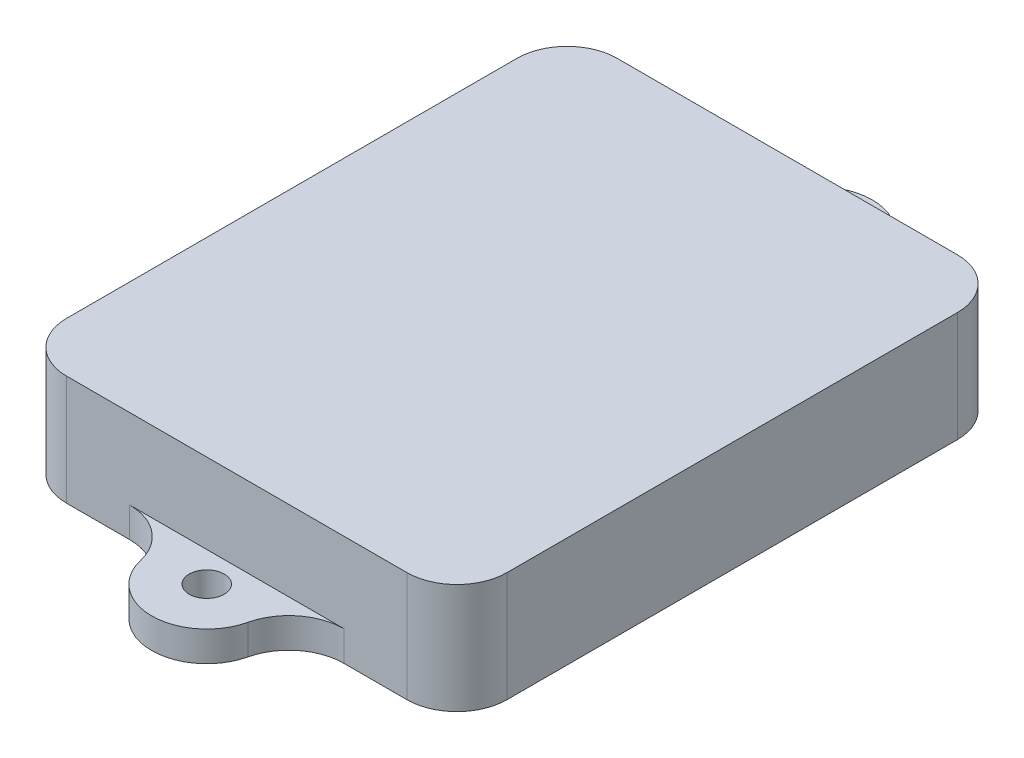
ISO-10303-21;
HEADER;
FILE_DESCRIPTION(('STEP AP214'),'2;1');
FILE_NAME('part.step','',(''),(''),'','','');
FILE_SCHEMA(('AUTOMOTIVE_DESIGN { 1 0 10303 214 1 1 1 1 }'));
ENDSEC;
DATA;
#1=APPLICATION_CONTEXT('core data for automotive mechanical design processes');
#2=APPLICATION_PROTOCOL_DEFINITION('international standard','automotive_design',2000,#1);
#3=PRODUCT_CONTEXT('',#1,'mechanical');
#4=PRODUCT('Part','Part','',(#3));
#5=PRODUCT_RELATED_PRODUCT_CATEGORY('part','',(#4));
#6=PRODUCT_DEFINITION_FORMATION('','',#4);
#7=PRODUCT_DEFINITION_CONTEXT('part definition',#1,'design');
#8=PRODUCT_DEFINITION('design','',#6,#7);
#9=PRODUCT_DEFINITION_SHAPE('','',#8);
#10=(LENGTH_UNIT() NAMED_UNIT(*) SI_UNIT(.MILLI.,.METRE.));
#11=(NAMED_UNIT(*) PLANE_ANGLE_UNIT() SI_UNIT($,.RADIAN.));
#12=(NAMED_UNIT(*) SI_UNIT($,.STERADIAN.) SOLID_ANGLE_UNIT());
#13=UNCERTAINTY_MEASURE_WITH_UNIT(LENGTH_MEASURE(1.E-05),#10,'distance_accuracy_value','');
#14=(GEOMETRIC_REPRESENTATION_CONTEXT(3) GLOBAL_UNCERTAINTY_ASSIGNED_CONTEXT((#13)) GLOBAL_UNIT_ASSIGNED_CONTEXT((#10,
#11,#12)) REPRESENTATION_CONTEXT('',''));
#15=CARTESIAN_POINT('',(0.,0.,0.));
#16=DIRECTION('',(0.,0.,1.));
#17=DIRECTION('',(1.,0.,0.));
#18=AXIS2_PLACEMENT_3D('',#15,#16,#17);
#19=CARTESIAN_POINT('',(-10.7121426428143,11.,33.));
#20=DIRECTION('',(0.,-1.,0.));
#21=DIRECTION('',(0.,0.,-1.));
#22=AXIS2_PLACEMENT_3D('',#19,#20,#21);
#23=CYLINDRICAL_SURFACE('',#22,5.5);
#24=CARTESIAN_POINT('',(-10.7121426428143,3.,33.));
#25=DIRECTION('',(0.,1.,0.));
#26=DIRECTION('',(0.,0.,1.));
#27=AXIS2_PLACEMENT_3D('',#24,#25,#26);
#28=CIRCLE('',#27,5.5);
#29=CARTESIAN_POINT('',(-10.7121426428143,3.,27.5));
#30=VERTEX_POINT('',#29);
#31=CARTESIAN_POINT('',(-5.35607132140714,3.,31.75));
#32=VERTEX_POINT('',#31);
#33=EDGE_CURVE('E155',#30,#32,#28,.F.);
#34=ORIENTED_EDGE('',*,*,#33,.F.);
#35=DIRECTION('',(0.,-1.,0.));
#36=VECTOR('',#35,1.);
#37=CARTESIAN_POINT('',(-10.7121426428143,11.,27.5));
#38=LINE('',#37,#36);
#39=CARTESIAN_POINT('',(-10.7121426428143,0.,27.5));
#40=VERTEX_POINT('',#39);
#41=EDGE_CURVE('E166',#30,#40,#38,.T.);
#42=ORIENTED_EDGE('',*,*,#41,.T.);
#43=CARTESIAN_POINT('',(-10.7121426428143,0.,33.));
#44=DIRECTION('',(0.,-1.,0.));
#45=DIRECTION('',(0.,0.,1.));
#46=AXIS2_PLACEMENT_3D('',#43,#44,#45);
#47=CIRCLE('',#46,5.5);
#48=CARTESIAN_POINT('',(-5.35607132140714,0.,31.75));
#49=VERTEX_POINT('',#48);
#50=EDGE_CURVE('E233',#40,#49,#47,.T.);
#51=ORIENTED_EDGE('',*,*,#50,.T.);
#52=DIRECTION('',(0.,-1.,0.));
#53=VECTOR('',#52,1.);
#54=CARTESIAN_POINT('',(-5.35607132140714,11.,31.75));
#55=LINE('',#54,#53);
#56=EDGE_CURVE('E12',#32,#49,#55,.T.);
#57=ORIENTED_EDGE('',*,*,#56,.F.);
#58=EDGE_LOOP('',(#34,#42,#51,#57));
#59=FACE_BOUND('',#58,.T.);
#60=ADVANCED_FACE('F41',(#59),#23,.F.);
#61=CARTESIAN_POINT('',(0.,11.,30.5));
#62=DIRECTION('',(0.,-1.,0.));
#63=DIRECTION('',(0.,0.,-1.));
#64=AXIS2_PLACEMENT_3D('',#61,#62,#63);
#65=CYLINDRICAL_SURFACE('',#64,5.5);
#66=DIRECTION('',(0.,-1.,0.));
#67=VECTOR('',#66,1.);
#68=CARTESIAN_POINT('',(5.35607132140714,11.,31.75));
#69=LINE('',#68,#67);
#70=CARTESIAN_POINT('',(5.35607132140714,3.,31.75));
#71=VERTEX_POINT('',#70);
#72=CARTESIAN_POINT('',(5.35607132140714,0.,31.75));
#73=VERTEX_POINT('',#72);
#74=EDGE_CURVE('E49',#71,#73,#69,.T.);
#75=ORIENTED_EDGE('',*,*,#74,.F.);
#76=CARTESIAN_POINT('',(0.,3.,30.5));
#77=DIRECTION('',(0.,1.,0.));
#78=DIRECTION('',(0.,0.,1.));
#79=AXIS2_PLACEMENT_3D('',#76,#77,#78);
#80=CIRCLE('',#79,5.5);
#81=EDGE_CURVE('E57',#32,#71,#80,.T.);
#82=ORIENTED_EDGE('',*,*,#81,.F.);
#83=ORIENTED_EDGE('',*,*,#56,.T.);
#84=CARTESIAN_POINT('',(0.,0.,30.5));
#85=DIRECTION('',(0.,1.,0.));
#86=DIRECTION('',(0.,0.,1.));
#87=AXIS2_PLACEMENT_3D('',#84,#85,#86);
#88=CIRCLE('',#87,5.5);
#89=EDGE_CURVE('E248',#49,#73,#88,.T.);
#90=ORIENTED_EDGE('',*,*,#89,.T.);
#91=EDGE_LOOP('',(#75,#82,#83,#90));
#92=FACE_BOUND('',#91,.T.);
#93=ADVANCED_FACE('F296',(#92),#65,.T.);
#94=CARTESIAN_POINT('',(10.7121426428143,11.,33.));
#95=DIRECTION('',(0.,-1.,0.));
#96=DIRECTION('',(0.,0.,-1.));
#97=AXIS2_PLACEMENT_3D('',#94,#95,#96);
#98=CYLINDRICAL_SURFACE('',#97,5.5);
#99=CARTESIAN_POINT('',(10.7121426428143,3.,33.));
#100=DIRECTION('',(0.,1.,0.));
#101=DIRECTION('',(0.,0.,1.));
#102=AXIS2_PLACEMENT_3D('',#99,#100,#101);
#103=CIRCLE('',#102,5.5);
#104=CARTESIAN_POINT('',(10.7121426428143,3.,27.5));
#105=VERTEX_POINT('',#104);
#106=EDGE_CURVE('E156',#71,#105,#103,.F.);
#107=ORIENTED_EDGE('',*,*,#106,.F.);
#108=ORIENTED_EDGE('',*,*,#74,.T.);
#109=CARTESIAN_POINT('',(10.7121426428143,0.,33.));
#110=DIRECTION('',(0.,-1.,0.));
#111=DIRECTION('',(0.,0.,-1.));
#112=AXIS2_PLACEMENT_3D('',#109,#110,#111);
#113=CIRCLE('',#112,5.5);
#114=CARTESIAN_POINT('',(10.7121426428143,0.,27.5));
#115=VERTEX_POINT('',#114);
#116=EDGE_CURVE('E251',#73,#115,#113,.T.);
#117=ORIENTED_EDGE('',*,*,#116,.T.);
#118=DIRECTION('',(0.,-1.,0.));
#119=VECTOR('',#118,1.);
#120=CARTESIAN_POINT('',(10.7121426428143,11.,27.5));
#121=LINE('',#120,#119);
#122=EDGE_CURVE('E213',#105,#115,#121,.T.);
#123=ORIENTED_EDGE('',*,*,#122,.F.);
#124=EDGE_LOOP('',(#107,#108,#117,#123));
#125=FACE_BOUND('',#124,.T.);
#126=ADVANCED_FACE('F298',(#125),#98,.F.);
#127=CARTESIAN_POINT('',(10.7121426428143,11.,-33.));
#128=DIRECTION('',(0.,-1.,0.));
#129=DIRECTION('',(0.,0.,-1.));
#130=AXIS2_PLACEMENT_3D('',#127,#128,#129);
#131=CYLINDRICAL_SURFACE('',#130,5.5);
#132=CARTESIAN_POINT('',(10.7121426428143,3.,-33.));
#133=DIRECTION('',(0.,1.,0.));
#134=DIRECTION('',(0.,0.,1.));
#135=AXIS2_PLACEMENT_3D('',#132,#133,#134);
#136=CIRCLE('',#135,5.5);
#137=CARTESIAN_POINT('',(10.7121426428143,3.,-27.5));
#138=VERTEX_POINT('',#137);
#139=CARTESIAN_POINT('',(5.35607132140713,3.,-31.75));
#140=VERTEX_POINT('',#139);
#141=EDGE_CURVE('E225',#138,#140,#136,.F.);
#142=ORIENTED_EDGE('',*,*,#141,.F.);
#143=DIRECTION('',(0.,-1.,0.));
#144=VECTOR('',#143,1.);
#145=CARTESIAN_POINT('',(10.7121426428143,11.,-27.5));
#146=LINE('',#145,#144);
#147=CARTESIAN_POINT('',(10.7121426428143,0.,-27.5));
#148=VERTEX_POINT('',#147);
#149=EDGE_CURVE('E199',#138,#148,#146,.T.);
#150=ORIENTED_EDGE('',*,*,#149,.T.);
#151=CARTESIAN_POINT('',(10.7121426428143,0.,-33.));
#152=DIRECTION('',(0.,-1.,0.));
#153=DIRECTION('',(0.,0.,1.));
#154=AXIS2_PLACEMENT_3D('',#151,#152,#153);
#155=CIRCLE('',#154,5.5);
#156=CARTESIAN_POINT('',(5.35607132140713,0.,-31.75));
#157=VERTEX_POINT('',#156);
#158=EDGE_CURVE('E265',#148,#157,#155,.T.);
#159=ORIENTED_EDGE('',*,*,#158,.T.);
#160=DIRECTION('',(0.,-1.,0.));
#161=VECTOR('',#160,1.);
#162=CARTESIAN_POINT('',(5.35607132140713,11.,-31.75));
#163=LINE('',#162,#161);
#164=EDGE_CURVE('E197',#140,#157,#163,.T.);
#165=ORIENTED_EDGE('',*,*,#164,.F.);
#166=EDGE_LOOP('',(#142,#150,#159,#165));
#167=FACE_BOUND('',#166,.T.);
#168=ADVANCED_FACE('F344',(#167),#131,.F.);
#169=CARTESIAN_POINT('',(0.,11.,-30.5));
#170=DIRECTION('',(0.,-1.,0.));
#171=DIRECTION('',(0.,0.,-1.));
#172=AXIS2_PLACEMENT_3D('',#169,#170,#171);
#173=CYLINDRICAL_SURFACE('',#172,5.5);
#174=CARTESIAN_POINT('',(0.,3.,-30.5));
#175=DIRECTION('',(0.,1.,0.));
#176=DIRECTION('',(0.,0.,1.));
#177=AXIS2_PLACEMENT_3D('',#174,#175,#176);
#178=CIRCLE('',#177,5.5);
#179=CARTESIAN_POINT('',(-5.35607132140714,3.,-31.75));
#180=VERTEX_POINT('',#179);
#181=EDGE_CURVE('E65',#140,#180,#178,.T.);
#182=ORIENTED_EDGE('',*,*,#181,.F.);
#183=ORIENTED_EDGE('',*,*,#164,.T.);
#184=CARTESIAN_POINT('',(0.,0.,-30.5));
#185=DIRECTION('',(0.,1.,0.));
#186=DIRECTION('',(0.,0.,-1.));
#187=AXIS2_PLACEMENT_3D('',#184,#185,#186);
#188=CIRCLE('',#187,5.5);
#189=CARTESIAN_POINT('',(-5.35607132140714,0.,-31.75));
#190=VERTEX_POINT('',#189);
#191=EDGE_CURVE('E268',#157,#190,#188,.T.);
#192=ORIENTED_EDGE('',*,*,#191,.T.);
#193=DIRECTION('',(0.,-1.,0.));
#194=VECTOR('',#193,1.);
#195=CARTESIAN_POINT('',(-5.35607132140714,11.,-31.75));
#196=LINE('',#195,#194);
#197=EDGE_CURVE('E195',#180,#190,#196,.T.);
#198=ORIENTED_EDGE('',*,*,#197,.F.);
#199=EDGE_LOOP('',(#182,#183,#192,#198));
#200=FACE_BOUND('',#199,.T.);
#201=ADVANCED_FACE('F340',(#200),#173,.T.);
#202=CARTESIAN_POINT('',(-10.7121426428143,11.,-33.));
#203=DIRECTION('',(0.,-1.,0.));
#204=DIRECTION('',(0.,0.,-1.));
#205=AXIS2_PLACEMENT_3D('',#202,#203,#204);
#206=CYLINDRICAL_SURFACE('',#205,5.5);
#207=CARTESIAN_POINT('',(-10.7121426428143,3.,-33.));
#208=DIRECTION('',(0.,1.,0.));
#209=DIRECTION('',(0.,0.,1.));
#210=AXIS2_PLACEMENT_3D('',#207,#208,#209);
#211=CIRCLE('',#210,5.5);
#212=CARTESIAN_POINT('',(-10.7121426428143,3.,-27.5));
#213=VERTEX_POINT('',#212);
#214=EDGE_CURVE('E222',#180,#213,#211,.F.);
#215=ORIENTED_EDGE('',*,*,#214,.F.);
#216=ORIENTED_EDGE('',*,*,#197,.T.);
#217=CARTESIAN_POINT('',(-10.7121426428143,0.,-33.));
#218=DIRECTION('',(0.,-1.,0.));
#219=DIRECTION('',(0.,0.,-1.));
#220=AXIS2_PLACEMENT_3D('',#217,#218,#219);
#221=CIRCLE('',#220,5.5);
#222=CARTESIAN_POINT('',(-10.7121426428143,0.,-27.5));
#223=VERTEX_POINT('',#222);
#224=EDGE_CURVE('E271',#190,#223,#221,.T.);
#225=ORIENTED_EDGE('',*,*,#224,.T.);
#226=DIRECTION('',(0.,-1.,0.));
#227=VECTOR('',#226,1.);
#228=CARTESIAN_POINT('',(-10.7121426428143,11.,-27.5));
#229=LINE('',#228,#227);
#230=EDGE_CURVE('E193',#213,#223,#229,.T.);
#231=ORIENTED_EDGE('',*,*,#230,.F.);
#232=EDGE_LOOP('',(#215,#216,#225,#231));
#233=FACE_BOUND('',#232,.T.);
#234=ADVANCED_FACE('F335',(#233),#206,.F.);
#235=CARTESIAN_POINT('',(0.,11.,-30.5));
#236=DIRECTION('',(0.,-1.,0.));
#237=DIRECTION('',(0.,0.,-1.));
#238=AXIS2_PLACEMENT_3D('',#235,#236,#237);
#239=CYLINDRICAL_SURFACE('',#238,1.75);
#240=CARTESIAN_POINT('',(0.,0.,-30.5));
#241=DIRECTION('',(0.,1.,0.));
#242=DIRECTION('',(0.,0.,1.));
#243=AXIS2_PLACEMENT_3D('',#240,#241,#242);
#244=CIRCLE('',#243,1.75);
#245=CARTESIAN_POINT('',(0.,0.,-28.75));
#246=VERTEX_POINT('',#245);
#247=EDGE_CURVE('E230',#246,#246,#244,.T.);
#248=ORIENTED_EDGE('',*,*,#247,.F.);
#249=EDGE_LOOP('',(#248));
#250=FACE_BOUND('',#249,.T.);
#251=CARTESIAN_POINT('',(0.,3.,-30.5));
#252=DIRECTION('',(0.,1.,0.));
#253=DIRECTION('',(0.,0.,1.));
#254=AXIS2_PLACEMENT_3D('',#251,#252,#253);
#255=CIRCLE('',#254,1.75);
#256=CARTESIAN_POINT('',(0.,3.,-28.75));
#257=VERTEX_POINT('',#256);
#258=EDGE_CURVE('E44',#257,#257,#255,.T.);
#259=ORIENTED_EDGE('',*,*,#258,.T.);
#260=EDGE_LOOP('',(#259));
#261=FACE_BOUND('',#260,.T.);
#262=ADVANCED_FACE('F378',(#250,#261),#239,.F.);
#263=CARTESIAN_POINT('',(0.,11.,30.5));
#264=DIRECTION('',(0.,-1.,0.));
#265=DIRECTION('',(0.,0.,-1.));
#266=AXIS2_PLACEMENT_3D('',#263,#264,#265);
#267=CYLINDRICAL_SURFACE('',#266,1.75);
#268=CARTESIAN_POINT('',(0.,0.,30.5));
#269=DIRECTION('',(0.,1.,0.));
#270=DIRECTION('',(0.,0.,1.));
#271=AXIS2_PLACEMENT_3D('',#268,#269,#270);
#272=CIRCLE('',#271,1.75);
#273=CARTESIAN_POINT('',(0.,0.,32.25));
#274=VERTEX_POINT('',#273);
#275=EDGE_CURVE('E227',#274,#274,#272,.T.);
#276=ORIENTED_EDGE('',*,*,#275,.F.);
#277=EDGE_LOOP('',(#276));
#278=FACE_BOUND('',#277,.T.);
#279=CARTESIAN_POINT('',(0.,3.,30.5));
#280=DIRECTION('',(0.,1.,0.));
#281=DIRECTION('',(0.,0.,1.));
#282=AXIS2_PLACEMENT_3D('',#279,#280,#281);
#283=CIRCLE('',#282,1.75);
#284=CARTESIAN_POINT('',(0.,3.,32.25));
#285=VERTEX_POINT('',#284);
#286=EDGE_CURVE('E160',#285,#285,#283,.T.);
#287=ORIENTED_EDGE('',*,*,#286,.T.);
#288=EDGE_LOOP('',(#287));
#289=FACE_BOUND('',#288,.T.);
#290=ADVANCED_FACE('F392',(#278,#289),#267,.F.);
#291=CARTESIAN_POINT('',(-10.7121426428143,11.,33.));
#292=DIRECTION('',(0.,1.,0.));
#293=DIRECTION('',(0.,0.,1.));
#294=AXIS2_PLACEMENT_3D('',#291,#292,#293);
#295=PLANE('',#294);
#296=CARTESIAN_POINT('',(-17.,11.,22.5));
#297=DIRECTION('',(0.,1.,0.));
#298=DIRECTION('',(0.,0.,-1.));
#299=AXIS2_PLACEMENT_3D('',#296,#297,#298);
#300=CIRCLE('',#299,5.);
#301=CARTESIAN_POINT('',(-22.,11.,22.5));
#302=VERTEX_POINT('',#301);
#303=CARTESIAN_POINT('',(-17.,11.,27.5));
#304=VERTEX_POINT('',#303);
#305=EDGE_CURVE('E175',#302,#304,#300,.T.);
#306=ORIENTED_EDGE('',*,*,#305,.T.);
#307=DIRECTION('',(1.,0.,0.));
#308=VECTOR('',#307,1.);
#309=CARTESIAN_POINT('',(17.,11.,27.5));
#310=LINE('',#309,#308);
#311=CARTESIAN_POINT('',(17.,11.,27.5));
#312=VERTEX_POINT('',#311);
#313=EDGE_CURVE('E234',#304,#312,#310,.T.);
#314=ORIENTED_EDGE('',*,*,#313,.T.);
#315=CARTESIAN_POINT('',(17.,11.,22.5));
#316=DIRECTION('',(0.,1.,0.));
#317=DIRECTION('',(0.,0.,1.));
#318=AXIS2_PLACEMENT_3D('',#315,#316,#317);
#319=CIRCLE('',#318,5.);
#320=CARTESIAN_POINT('',(22.,11.,22.5));
#321=VERTEX_POINT('',#320);
#322=EDGE_CURVE('E236',#312,#321,#319,.T.);
#323=ORIENTED_EDGE('',*,*,#322,.T.);
#324=DIRECTION('',(0.,0.,-1.));
#325=VECTOR('',#324,1.);
#326=CARTESIAN_POINT('',(22.,11.,22.5));
#327=LINE('',#326,#325);
#328=CARTESIAN_POINT('',(22.,11.,-22.5));
#329=VERTEX_POINT('',#328);
#330=EDGE_CURVE('E238',#321,#329,#327,.T.);
#331=ORIENTED_EDGE('',*,*,#330,.T.);
#332=CARTESIAN_POINT('',(17.,11.,-22.5));
#333=DIRECTION('',(0.,1.,0.));
#334=DIRECTION('',(0.,0.,1.));
#335=AXIS2_PLACEMENT_3D('',#332,#333,#334);
#336=CIRCLE('',#335,5.);
#337=CARTESIAN_POINT('',(17.,11.,-27.5));
#338=VERTEX_POINT('',#337);
#339=EDGE_CURVE('E240',#329,#338,#336,.T.);
#340=ORIENTED_EDGE('',*,*,#339,.T.);
#341=DIRECTION('',(-1.,0.,0.));
#342=VECTOR('',#341,1.);
#343=CARTESIAN_POINT('',(17.,11.,-27.5));
#344=LINE('',#343,#342);
#345=CARTESIAN_POINT('',(-17.,11.,-27.5));
#346=VERTEX_POINT('',#345);
#347=EDGE_CURVE('E242',#338,#346,#344,.T.);
#348=ORIENTED_EDGE('',*,*,#347,.T.);
#349=CARTESIAN_POINT('',(-17.,11.,-22.5));
#350=DIRECTION('',(0.,1.,0.));
#351=DIRECTION('',(0.,0.,1.));
#352=AXIS2_PLACEMENT_3D('',#349,#350,#351);
#353=CIRCLE('',#352,5.);
#354=CARTESIAN_POINT('',(-22.,11.,-22.5));
#355=VERTEX_POINT('',#354);
#356=EDGE_CURVE('E244',#346,#355,#353,.T.);
#357=ORIENTED_EDGE('',*,*,#356,.T.);
#358=DIRECTION('',(0.,0.,1.));
#359=VECTOR('',#358,1.);
#360=CARTESIAN_POINT('',(-22.,11.,22.5));
#361=LINE('',#360,#359);
#362=EDGE_CURVE('E180',#355,#302,#361,.T.);
#363=ORIENTED_EDGE('',*,*,#362,.T.);
#364=EDGE_LOOP('',(#306,#314,#323,#331,#340,#348,#357,#363));
#365=FACE_BOUND('',#364,.T.);
#366=ADVANCED_FACE('F317',(#365),#295,.T.);
#367=CARTESIAN_POINT('',(-10.7121426428143,0.,33.));
#368=DIRECTION('',(0.,1.,0.));
#369=DIRECTION('',(0.,0.,1.));
#370=AXIS2_PLACEMENT_3D('',#367,#368,#369);
#371=PLANE('',#370);
#372=ORIENTED_EDGE('',*,*,#50,.F.);
#373=DIRECTION('',(1.,0.,0.));
#374=VECTOR('',#373,1.);
#375=CARTESIAN_POINT('',(-10.7121426428143,0.,27.5));
#376=LINE('',#375,#374);
#377=CARTESIAN_POINT('',(-17.,0.,27.5));
#378=VERTEX_POINT('',#377);
#379=EDGE_CURVE('E172',#378,#40,#376,.T.);
#380=ORIENTED_EDGE('',*,*,#379,.F.);
#381=CARTESIAN_POINT('',(-17.,0.,22.5));
#382=DIRECTION('',(0.,1.,0.));
#383=DIRECTION('',(0.,0.,-1.));
#384=AXIS2_PLACEMENT_3D('',#381,#382,#383);
#385=CIRCLE('',#384,5.);
#386=CARTESIAN_POINT('',(-22.,0.,22.5));
#387=VERTEX_POINT('',#386);
#388=EDGE_CURVE('E279',#387,#378,#385,.T.);
#389=ORIENTED_EDGE('',*,*,#388,.F.);
#390=DIRECTION('',(0.,0.,1.));
#391=VECTOR('',#390,1.);
#392=CARTESIAN_POINT('',(-22.,0.,22.5));
#393=LINE('',#392,#391);
#394=CARTESIAN_POINT('',(-22.,0.,-22.5));
#395=VERTEX_POINT('',#394);
#396=EDGE_CURVE('E278',#395,#387,#393,.T.);
#397=ORIENTED_EDGE('',*,*,#396,.F.);
#398=CARTESIAN_POINT('',(-17.,0.,-22.5));
#399=DIRECTION('',(0.,1.,0.));
#400=DIRECTION('',(0.,0.,1.));
#401=AXIS2_PLACEMENT_3D('',#398,#399,#400);
#402=CIRCLE('',#401,5.);
#403=CARTESIAN_POINT('',(-17.,0.,-27.5));
#404=VERTEX_POINT('',#403);
#405=EDGE_CURVE('E276',#404,#395,#402,.T.);
#406=ORIENTED_EDGE('',*,*,#405,.F.);
#407=DIRECTION('',(-1.,0.,0.));
#408=VECTOR('',#407,1.);
#409=CARTESIAN_POINT('',(-10.7121426428143,0.,-27.5));
#410=LINE('',#409,#408);
#411=EDGE_CURVE('E274',#223,#404,#410,.T.);
#412=ORIENTED_EDGE('',*,*,#411,.F.);
#413=ORIENTED_EDGE('',*,*,#224,.F.);
#414=ORIENTED_EDGE('',*,*,#191,.F.);
#415=ORIENTED_EDGE('',*,*,#158,.F.);
#416=DIRECTION('',(-1.,0.,0.));
#417=VECTOR('',#416,1.);
#418=CARTESIAN_POINT('',(17.,0.,-27.5));
#419=LINE('',#418,#417);
#420=CARTESIAN_POINT('',(17.,0.,-27.5));
#421=VERTEX_POINT('',#420);
#422=EDGE_CURVE('E262',#421,#148,#419,.T.);
#423=ORIENTED_EDGE('',*,*,#422,.F.);
#424=CARTESIAN_POINT('',(17.,0.,-22.5));
#425=DIRECTION('',(0.,1.,0.));
#426=DIRECTION('',(0.,0.,1.));
#427=AXIS2_PLACEMENT_3D('',#424,#425,#426);
#428=CIRCLE('',#427,5.);
#429=CARTESIAN_POINT('',(22.,0.,-22.5));
#430=VERTEX_POINT('',#429);
#431=EDGE_CURVE('E260',#430,#421,#428,.T.);
#432=ORIENTED_EDGE('',*,*,#431,.F.);
#433=DIRECTION('',(0.,0.,-1.));
#434=VECTOR('',#433,1.);
#435=CARTESIAN_POINT('',(22.,0.,22.5));
#436=LINE('',#435,#434);
#437=CARTESIAN_POINT('',(22.,0.,22.5));
#438=VERTEX_POINT('',#437);
#439=EDGE_CURVE('E258',#438,#430,#436,.T.);
#440=ORIENTED_EDGE('',*,*,#439,.F.);
#441=CARTESIAN_POINT('',(17.,0.,22.5));
#442=DIRECTION('',(0.,1.,0.));
#443=DIRECTION('',(0.,0.,1.));
#444=AXIS2_PLACEMENT_3D('',#441,#442,#443);
#445=CIRCLE('',#444,5.);
#446=CARTESIAN_POINT('',(17.,0.,27.5));
#447=VERTEX_POINT('',#446);
#448=EDGE_CURVE('E256',#447,#438,#445,.T.);
#449=ORIENTED_EDGE('',*,*,#448,.F.);
#450=DIRECTION('',(1.,0.,0.));
#451=VECTOR('',#450,1.);
#452=CARTESIAN_POINT('',(17.,0.,27.5));
#453=LINE('',#452,#451);
#454=EDGE_CURVE('E254',#115,#447,#453,.T.);
#455=ORIENTED_EDGE('',*,*,#454,.F.);
#456=ORIENTED_EDGE('',*,*,#116,.F.);
#457=ORIENTED_EDGE('',*,*,#89,.F.);
#458=EDGE_LOOP('',(#372,#380,#389,#397,#406,#412,#413,#414,#415,#423,#432,#440,#449,#455,#456,#457));
#459=FACE_BOUND('',#458,.T.);
#460=ORIENTED_EDGE('',*,*,#247,.T.);
#461=EDGE_LOOP('',(#460));
#462=FACE_BOUND('',#461,.T.);
#463=ORIENTED_EDGE('',*,*,#275,.T.);
#464=EDGE_LOOP('',(#463));
#465=FACE_BOUND('',#464,.T.);
#466=ADVANCED_FACE('F289',(#459,#462,#465),#371,.F.);
#467=CARTESIAN_POINT('',(17.,11.,22.5));
#468=DIRECTION('',(0.,-1.,0.));
#469=DIRECTION('',(0.,0.,-1.));
#470=AXIS2_PLACEMENT_3D('',#467,#468,#469);
#471=CYLINDRICAL_SURFACE('',#470,5.);
#472=ORIENTED_EDGE('',*,*,#448,.T.);
#473=DIRECTION('',(0.,-1.,0.));
#474=VECTOR('',#473,1.);
#475=CARTESIAN_POINT('',(22.,11.,22.5));
#476=LINE('',#475,#474);
#477=EDGE_CURVE('E207',#321,#438,#476,.T.);
#478=ORIENTED_EDGE('',*,*,#477,.F.);
#479=ORIENTED_EDGE('',*,*,#322,.F.);
#480=DIRECTION('',(0.,-1.,0.));
#481=VECTOR('',#480,1.);
#482=CARTESIAN_POINT('',(17.,11.,27.5));
#483=LINE('',#482,#481);
#484=EDGE_CURVE('E210',#312,#447,#483,.T.);
#485=ORIENTED_EDGE('',*,*,#484,.T.);
#486=EDGE_LOOP('',(#472,#478,#479,#485));
#487=FACE_BOUND('',#486,.T.);
#488=ADVANCED_FACE('F302',(#487),#471,.T.);
#489=CARTESIAN_POINT('',(22.,11.,22.5));
#490=DIRECTION('',(-1.,0.,0.));
#491=DIRECTION('',(0.,0.,1.));
#492=AXIS2_PLACEMENT_3D('',#489,#490,#491);
#493=PLANE('',#492);
#494=ORIENTED_EDGE('',*,*,#439,.T.);
#495=DIRECTION('',(0.,-1.,0.));
#496=VECTOR('',#495,1.);
#497=CARTESIAN_POINT('',(22.,11.,-22.5));
#498=LINE('',#497,#496);
#499=EDGE_CURVE('E204',#329,#430,#498,.T.);
#500=ORIENTED_EDGE('',*,*,#499,.F.);
#501=ORIENTED_EDGE('',*,*,#330,.F.);
#502=ORIENTED_EDGE('',*,*,#477,.T.);
#503=EDGE_LOOP('',(#494,#500,#501,#502));
#504=FACE_BOUND('',#503,.T.);
#505=ADVANCED_FACE('F309',(#504),#493,.F.);
#506=CARTESIAN_POINT('',(17.,11.,-22.5));
#507=DIRECTION('',(0.,-1.,0.));
#508=DIRECTION('',(0.,0.,-1.));
#509=AXIS2_PLACEMENT_3D('',#506,#507,#508);
#510=CYLINDRICAL_SURFACE('',#509,5.);
#511=ORIENTED_EDGE('',*,*,#431,.T.);
#512=DIRECTION('',(0.,-1.,0.));
#513=VECTOR('',#512,1.);
#514=CARTESIAN_POINT('',(17.,11.,-27.5));
#515=LINE('',#514,#513);
#516=EDGE_CURVE('E201',#338,#421,#515,.T.);
#517=ORIENTED_EDGE('',*,*,#516,.F.);
#518=ORIENTED_EDGE('',*,*,#339,.F.);
#519=ORIENTED_EDGE('',*,*,#499,.T.);
#520=EDGE_LOOP('',(#511,#517,#518,#519));
#521=FACE_BOUND('',#520,.T.);
#522=ADVANCED_FACE('F313',(#521),#510,.T.);
#523=CARTESIAN_POINT('',(-10.7121426428143,11.,-27.5));
#524=DIRECTION('',(0.,0.,1.));
#525=DIRECTION('',(1.,0.,0.));
#526=AXIS2_PLACEMENT_3D('',#523,#524,#525);
#527=PLANE('',#526);
#528=DIRECTION('',(0.,-1.,0.));
#529=VECTOR('',#528,1.);
#530=CARTESIAN_POINT('',(-17.,11.,-27.5));
#531=LINE('',#530,#529);
#532=EDGE_CURVE('E190',#346,#404,#531,.T.);
#533=ORIENTED_EDGE('',*,*,#532,.F.);
#534=ORIENTED_EDGE('',*,*,#347,.F.);
#535=ORIENTED_EDGE('',*,*,#516,.T.);
#536=ORIENTED_EDGE('',*,*,#422,.T.);
#537=ORIENTED_EDGE('',*,*,#149,.F.);
#538=DIRECTION('',(-1.,0.,0.));
#539=VECTOR('',#538,1.);
#540=CARTESIAN_POINT('',(-13.8560713214071,3.,-27.5));
#541=LINE('',#540,#539);
#542=EDGE_CURVE('E161',#138,#213,#541,.T.);
#543=ORIENTED_EDGE('',*,*,#542,.T.);
#544=ORIENTED_EDGE('',*,*,#230,.T.);
#545=ORIENTED_EDGE('',*,*,#411,.T.);
#546=EDGE_LOOP('',(#533,#534,#535,#536,#537,#543,#544,#545));
#547=FACE_BOUND('',#546,.T.);
#548=ADVANCED_FACE('F330',(#547),#527,.F.);
#549=CARTESIAN_POINT('',(-17.,11.,-22.5));
#550=DIRECTION('',(0.,-1.,0.));
#551=DIRECTION('',(0.,0.,-1.));
#552=AXIS2_PLACEMENT_3D('',#549,#550,#551);
#553=CYLINDRICAL_SURFACE('',#552,5.);
#554=ORIENTED_EDGE('',*,*,#405,.T.);
#555=DIRECTION('',(0.,-1.,0.));
#556=VECTOR('',#555,1.);
#557=CARTESIAN_POINT('',(-22.,11.,-22.5));
#558=LINE('',#557,#556);
#559=EDGE_CURVE('E187',#355,#395,#558,.T.);
#560=ORIENTED_EDGE('',*,*,#559,.F.);
#561=ORIENTED_EDGE('',*,*,#356,.F.);
#562=ORIENTED_EDGE('',*,*,#532,.T.);
#563=EDGE_LOOP('',(#554,#560,#561,#562));
#564=FACE_BOUND('',#563,.T.);
#565=ADVANCED_FACE('F328',(#564),#553,.T.);
#566=CARTESIAN_POINT('',(-22.,11.,22.5));
#567=DIRECTION('',(1.,0.,0.));
#568=DIRECTION('',(0.,0.,-1.));
#569=AXIS2_PLACEMENT_3D('',#566,#567,#568);
#570=PLANE('',#569);
#571=ORIENTED_EDGE('',*,*,#396,.T.);
#572=DIRECTION('',(0.,-1.,0.));
#573=VECTOR('',#572,1.);
#574=CARTESIAN_POINT('',(-22.,11.,22.5));
#575=LINE('',#574,#573);
#576=EDGE_CURVE('E177',#302,#387,#575,.T.);
#577=ORIENTED_EDGE('',*,*,#576,.F.);
#578=ORIENTED_EDGE('',*,*,#362,.F.);
#579=ORIENTED_EDGE('',*,*,#559,.T.);
#580=EDGE_LOOP('',(#571,#577,#578,#579));
#581=FACE_BOUND('',#580,.T.);
#582=ADVANCED_FACE('F323',(#581),#570,.F.);
#583=CARTESIAN_POINT('',(-17.,11.,22.5));
#584=DIRECTION('',(0.,-1.,0.));
#585=DIRECTION('',(0.,0.,-1.));
#586=AXIS2_PLACEMENT_3D('',#583,#584,#585);
#587=CYLINDRICAL_SURFACE('',#586,5.);
#588=ORIENTED_EDGE('',*,*,#388,.T.);
#589=DIRECTION('',(0.,-1.,0.));
#590=VECTOR('',#589,1.);
#591=CARTESIAN_POINT('',(-17.,11.,27.5));
#592=LINE('',#591,#590);
#593=EDGE_CURVE('E174',#304,#378,#592,.T.);
#594=ORIENTED_EDGE('',*,*,#593,.F.);
#595=ORIENTED_EDGE('',*,*,#305,.F.);
#596=ORIENTED_EDGE('',*,*,#576,.T.);
#597=EDGE_LOOP('',(#588,#594,#595,#596));
#598=FACE_BOUND('',#597,.T.);
#599=ADVANCED_FACE('F283',(#598),#587,.T.);
#600=CARTESIAN_POINT('',(-10.7121426428143,11.,27.5));
#601=DIRECTION('',(0.,0.,-1.));
#602=DIRECTION('',(-1.,0.,0.));
#603=AXIS2_PLACEMENT_3D('',#600,#601,#602);
#604=PLANE('',#603);
#605=ORIENTED_EDGE('',*,*,#313,.F.);
#606=ORIENTED_EDGE('',*,*,#593,.T.);
#607=ORIENTED_EDGE('',*,*,#379,.T.);
#608=ORIENTED_EDGE('',*,*,#41,.F.);
#609=DIRECTION('',(1.,0.,0.));
#610=VECTOR('',#609,1.);
#611=CARTESIAN_POINT('',(-13.8560713214071,3.,27.5));
#612=LINE('',#611,#610);
#613=EDGE_CURVE('E152',#30,#105,#612,.T.);
#614=ORIENTED_EDGE('',*,*,#613,.T.);
#615=ORIENTED_EDGE('',*,*,#122,.T.);
#616=ORIENTED_EDGE('',*,*,#454,.T.);
#617=ORIENTED_EDGE('',*,*,#484,.F.);
#618=EDGE_LOOP('',(#605,#606,#607,#608,#614,#615,#616,#617));
#619=FACE_BOUND('',#618,.T.);
#620=ADVANCED_FACE('F169',(#619),#604,.F.);
#621=CARTESIAN_POINT('',(-10.7121426428143,3.,33.));
#622=DIRECTION('',(0.,1.,0.));
#623=DIRECTION('',(0.,0.,1.));
#624=AXIS2_PLACEMENT_3D('',#621,#622,#623);
#625=PLANE('',#624);
#626=ORIENTED_EDGE('',*,*,#286,.F.);
#627=EDGE_LOOP('',(#626));
#628=FACE_BOUND('',#627,.T.);
#629=ORIENTED_EDGE('',*,*,#33,.T.);
#630=ORIENTED_EDGE('',*,*,#81,.T.);
#631=ORIENTED_EDGE('',*,*,#106,.T.);
#632=ORIENTED_EDGE('',*,*,#613,.F.);
#633=EDGE_LOOP('',(#629,#630,#631,#632));
#634=FACE_BOUND('',#633,.T.);
#635=ADVANCED_FACE('F154',(#628,#634),#625,.T.);
#636=CARTESIAN_POINT('',(-10.7121426428143,3.,33.));
#637=DIRECTION('',(0.,1.,0.));
#638=DIRECTION('',(0.,0.,1.));
#639=AXIS2_PLACEMENT_3D('',#636,#637,#638);
#640=PLANE('',#639);
#641=ORIENTED_EDGE('',*,*,#258,.F.);
#642=EDGE_LOOP('',(#641));
#643=FACE_BOUND('',#642,.T.);
#644=ORIENTED_EDGE('',*,*,#141,.T.);
#645=ORIENTED_EDGE('',*,*,#181,.T.);
#646=ORIENTED_EDGE('',*,*,#214,.T.);
#647=ORIENTED_EDGE('',*,*,#542,.F.);
#648=EDGE_LOOP('',(#644,#645,#646,#647));
#649=FACE_BOUND('',#648,.T.);
#650=ADVANCED_FACE('F345',(#643,#649),#640,.T.);
#651=CLOSED_SHELL('',(#60,#93,#126,#168,#201,#234,#262,#290,#366,#466,#488,#505,#522,#548,#565,
#582,#599,#620,#635,#650));
#652=MANIFOLD_SOLID_BREP('B2',#651);
#653=ADVANCED_BREP_SHAPE_REPRESENTATION('',(#18,#652),#14);
#654=SHAPE_DEFINITION_REPRESENTATION(#9,#653);
ENDSEC;
END-ISO-10303-21;
